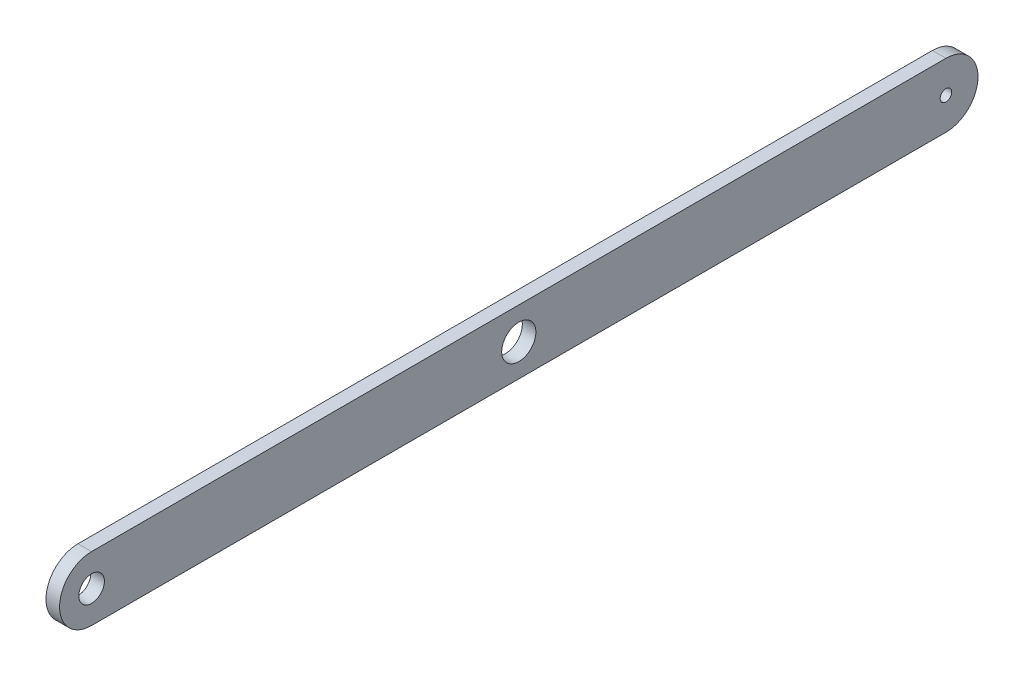
ISO-10303-21;
HEADER;
FILE_DESCRIPTION(('STEP AP214'),'2;1');
FILE_NAME('part.step','',(''),(''),'','','');
FILE_SCHEMA(('AUTOMOTIVE_DESIGN { 1 0 10303 214 1 1 1 1 }'));
ENDSEC;
DATA;
#1=APPLICATION_CONTEXT('core data for automotive mechanical design processes');
#2=APPLICATION_PROTOCOL_DEFINITION('international standard','automotive_design',2000,#1);
#3=PRODUCT_CONTEXT('',#1,'mechanical');
#4=PRODUCT('Part','Part','',(#3));
#5=PRODUCT_RELATED_PRODUCT_CATEGORY('part','',(#4));
#6=PRODUCT_DEFINITION_FORMATION('','',#4);
#7=PRODUCT_DEFINITION_CONTEXT('part definition',#1,'design');
#8=PRODUCT_DEFINITION('design','',#6,#7);
#9=PRODUCT_DEFINITION_SHAPE('','',#8);
#10=(LENGTH_UNIT() NAMED_UNIT(*) SI_UNIT(.MILLI.,.METRE.));
#11=(NAMED_UNIT(*) PLANE_ANGLE_UNIT() SI_UNIT($,.RADIAN.));
#12=(NAMED_UNIT(*) SI_UNIT($,.STERADIAN.) SOLID_ANGLE_UNIT());
#13=UNCERTAINTY_MEASURE_WITH_UNIT(LENGTH_MEASURE(1.E-05),#10,'distance_accuracy_value','');
#14=(GEOMETRIC_REPRESENTATION_CONTEXT(3) GLOBAL_UNCERTAINTY_ASSIGNED_CONTEXT((#13)) GLOBAL_UNIT_ASSIGNED_CONTEXT((#10,
#11,#12)) REPRESENTATION_CONTEXT('',''));
#15=CARTESIAN_POINT('',(0.,0.,0.));
#16=DIRECTION('',(0.,0.,1.));
#17=DIRECTION('',(1.,0.,0.));
#18=AXIS2_PLACEMENT_3D('',#15,#16,#17);
#19=CARTESIAN_POINT('',(3.175,-7.49999999999998,0.));
#20=DIRECTION('',(0.,1.,0.));
#21=DIRECTION('',(0.,0.,1.));
#22=AXIS2_PLACEMENT_3D('',#19,#20,#21);
#23=PLANE('',#22);
#24=DIRECTION('',(0.,0.,-1.));
#25=VECTOR('',#24,1.);
#26=CARTESIAN_POINT('',(0.,-7.49999999999998,0.));
#27=LINE('',#26,#25);
#28=CARTESIAN_POINT('',(0.,-7.5,100.));
#29=VERTEX_POINT('',#28);
#30=CARTESIAN_POINT('',(0.,-7.49999999999996,-100.));
#31=VERTEX_POINT('',#30);
#32=EDGE_CURVE('E126',#29,#31,#27,.T.);
#33=ORIENTED_EDGE('',*,*,#32,.T.);
#34=DIRECTION('',(-1.,0.,0.));
#35=VECTOR('',#34,1.);
#36=CARTESIAN_POINT('',(3.175,-7.49999999999996,-100.));
#37=LINE('',#36,#35);
#38=CARTESIAN_POINT('',(3.175,-7.49999999999996,-100.));
#39=VERTEX_POINT('',#38);
#40=EDGE_CURVE('E11',#39,#31,#37,.T.);
#41=ORIENTED_EDGE('',*,*,#40,.F.);
#42=DIRECTION('',(0.,0.,-1.));
#43=VECTOR('',#42,1.);
#44=CARTESIAN_POINT('',(3.175,-7.49999999999998,0.));
#45=LINE('',#44,#43);
#46=CARTESIAN_POINT('',(3.175,-7.5,100.));
#47=VERTEX_POINT('',#46);
#48=EDGE_CURVE('E98',#47,#39,#45,.T.);
#49=ORIENTED_EDGE('',*,*,#48,.F.);
#50=DIRECTION('',(-1.,0.,0.));
#51=VECTOR('',#50,1.);
#52=CARTESIAN_POINT('',(3.175,-7.5,100.));
#53=LINE('',#52,#51);
#54=EDGE_CURVE('E113',#47,#29,#53,.T.);
#55=ORIENTED_EDGE('',*,*,#54,.T.);
#56=EDGE_LOOP('',(#33,#41,#49,#55));
#57=FACE_BOUND('',#56,.T.);
#58=ADVANCED_FACE('F46',(#57),#23,.F.);
#59=CARTESIAN_POINT('',(3.175,0.,-100.));
#60=DIRECTION('',(-1.,0.,0.));
#61=DIRECTION('',(0.,0.,1.));
#62=AXIS2_PLACEMENT_3D('',#59,#60,#61);
#63=CYLINDRICAL_SURFACE('',#62,7.5);
#64=CARTESIAN_POINT('',(0.,0.,-100.));
#65=DIRECTION('',(1.,0.,0.));
#66=DIRECTION('',(0.,0.,-1.));
#67=AXIS2_PLACEMENT_3D('',#64,#65,#66);
#68=CIRCLE('',#67,7.5);
#69=CARTESIAN_POINT('',(0.,7.50000000000004,-100.));
#70=VERTEX_POINT('',#69);
#71=EDGE_CURVE('E103',#31,#70,#68,.T.);
#72=ORIENTED_EDGE('',*,*,#71,.T.);
#73=DIRECTION('',(-1.,0.,0.));
#74=VECTOR('',#73,1.);
#75=CARTESIAN_POINT('',(3.175,7.50000000000004,-100.));
#76=LINE('',#75,#74);
#77=CARTESIAN_POINT('',(3.175,7.50000000000004,-100.));
#78=VERTEX_POINT('',#77);
#79=EDGE_CURVE('E55',#78,#70,#76,.T.);
#80=ORIENTED_EDGE('',*,*,#79,.F.);
#81=CARTESIAN_POINT('',(3.175,0.,-100.));
#82=DIRECTION('',(1.,0.,0.));
#83=DIRECTION('',(0.,0.,-1.));
#84=AXIS2_PLACEMENT_3D('',#81,#82,#83);
#85=CIRCLE('',#84,7.5);
#86=EDGE_CURVE('E93',#39,#78,#85,.T.);
#87=ORIENTED_EDGE('',*,*,#86,.F.);
#88=ORIENTED_EDGE('',*,*,#40,.T.);
#89=EDGE_LOOP('',(#72,#80,#87,#88));
#90=FACE_BOUND('',#89,.T.);
#91=ADVANCED_FACE('F102',(#90),#63,.T.);
#92=CARTESIAN_POINT('',(3.175,7.50000000000002,0.));
#93=DIRECTION('',(0.,1.,0.));
#94=DIRECTION('',(0.,0.,1.));
#95=AXIS2_PLACEMENT_3D('',#92,#93,#94);
#96=PLANE('',#95);
#97=DIRECTION('',(0.,0.,-1.));
#98=VECTOR('',#97,1.);
#99=CARTESIAN_POINT('',(0.,7.50000000000002,0.));
#100=LINE('',#99,#98);
#101=CARTESIAN_POINT('',(0.,7.5,100.));
#102=VERTEX_POINT('',#101);
#103=EDGE_CURVE('E130',#102,#70,#100,.T.);
#104=ORIENTED_EDGE('',*,*,#103,.F.);
#105=DIRECTION('',(-1.,0.,0.));
#106=VECTOR('',#105,1.);
#107=CARTESIAN_POINT('',(3.175,7.5,100.));
#108=LINE('',#107,#106);
#109=CARTESIAN_POINT('',(3.175,7.5,100.));
#110=VERTEX_POINT('',#109);
#111=EDGE_CURVE('E83',#110,#102,#108,.T.);
#112=ORIENTED_EDGE('',*,*,#111,.F.);
#113=DIRECTION('',(0.,0.,-1.));
#114=VECTOR('',#113,1.);
#115=CARTESIAN_POINT('',(3.175,7.50000000000002,0.));
#116=LINE('',#115,#114);
#117=EDGE_CURVE('E96',#110,#78,#116,.T.);
#118=ORIENTED_EDGE('',*,*,#117,.T.);
#119=ORIENTED_EDGE('',*,*,#79,.T.);
#120=EDGE_LOOP('',(#104,#112,#118,#119));
#121=FACE_BOUND('',#120,.T.);
#122=ADVANCED_FACE('F107',(#121),#96,.T.);
#123=CARTESIAN_POINT('',(3.175,0.,100.));
#124=DIRECTION('',(-1.,0.,0.));
#125=DIRECTION('',(0.,0.,1.));
#126=AXIS2_PLACEMENT_3D('',#123,#124,#125);
#127=CYLINDRICAL_SURFACE('',#126,3.00000000000001);
#128=CARTESIAN_POINT('',(3.175,0.,100.));
#129=DIRECTION('',(1.,0.,0.));
#130=DIRECTION('',(0.,0.,-1.));
#131=AXIS2_PLACEMENT_3D('',#128,#129,#130);
#132=CIRCLE('',#131,3.00000000000001);
#133=CARTESIAN_POINT('',(3.175,0.,97.));
#134=VERTEX_POINT('',#133);
#135=EDGE_CURVE('E139',#134,#134,#132,.T.);
#136=ORIENTED_EDGE('',*,*,#135,.T.);
#137=EDGE_LOOP('',(#136));
#138=FACE_BOUND('',#137,.T.);
#139=CARTESIAN_POINT('',(0.,0.,100.));
#140=DIRECTION('',(1.,0.,0.));
#141=DIRECTION('',(0.,0.,-1.));
#142=AXIS2_PLACEMENT_3D('',#139,#140,#141);
#143=CIRCLE('',#142,3.00000000000001);
#144=CARTESIAN_POINT('',(0.,0.,97.));
#145=VERTEX_POINT('',#144);
#146=EDGE_CURVE('E121',#145,#145,#143,.T.);
#147=ORIENTED_EDGE('',*,*,#146,.F.);
#148=EDGE_LOOP('',(#147));
#149=FACE_BOUND('',#148,.T.);
#150=ADVANCED_FACE('F164',(#138,#149),#127,.F.);
#151=CARTESIAN_POINT('',(3.175,0.,0.));
#152=DIRECTION('',(-1.,0.,0.));
#153=DIRECTION('',(0.,0.,1.));
#154=AXIS2_PLACEMENT_3D('',#151,#152,#153);
#155=CYLINDRICAL_SURFACE('',#154,4.);
#156=CARTESIAN_POINT('',(3.175,0.,0.));
#157=DIRECTION('',(1.,0.,0.));
#158=DIRECTION('',(0.,0.,-1.));
#159=AXIS2_PLACEMENT_3D('',#156,#157,#158);
#160=CIRCLE('',#159,4.);
#161=CARTESIAN_POINT('',(3.175,0.,-4.));
#162=VERTEX_POINT('',#161);
#163=EDGE_CURVE('E134',#162,#162,#160,.T.);
#164=ORIENTED_EDGE('',*,*,#163,.T.);
#165=EDGE_LOOP('',(#164));
#166=FACE_BOUND('',#165,.T.);
#167=CARTESIAN_POINT('',(0.,0.,0.));
#168=DIRECTION('',(1.,0.,0.));
#169=DIRECTION('',(0.,0.,-1.));
#170=AXIS2_PLACEMENT_3D('',#167,#168,#169);
#171=CIRCLE('',#170,4.);
#172=CARTESIAN_POINT('',(0.,0.,-4.));
#173=VERTEX_POINT('',#172);
#174=EDGE_CURVE('E117',#173,#173,#171,.T.);
#175=ORIENTED_EDGE('',*,*,#174,.F.);
#176=EDGE_LOOP('',(#175));
#177=FACE_BOUND('',#176,.T.);
#178=ADVANCED_FACE('F48',(#166,#177),#155,.F.);
#179=CARTESIAN_POINT('',(3.175,0.,100.));
#180=DIRECTION('',(-1.,0.,0.));
#181=DIRECTION('',(0.,0.,1.));
#182=AXIS2_PLACEMENT_3D('',#179,#180,#181);
#183=CYLINDRICAL_SURFACE('',#182,7.5);
#184=CARTESIAN_POINT('',(0.,0.,100.));
#185=DIRECTION('',(1.,0.,0.));
#186=DIRECTION('',(0.,0.,-1.));
#187=AXIS2_PLACEMENT_3D('',#184,#185,#186);
#188=CIRCLE('',#187,7.5);
#189=EDGE_CURVE('E86',#102,#29,#188,.T.);
#190=ORIENTED_EDGE('',*,*,#189,.T.);
#191=ORIENTED_EDGE('',*,*,#54,.F.);
#192=CARTESIAN_POINT('',(3.175,0.,100.));
#193=DIRECTION('',(1.,0.,0.));
#194=DIRECTION('',(0.,0.,-1.));
#195=AXIS2_PLACEMENT_3D('',#192,#193,#194);
#196=CIRCLE('',#195,7.5);
#197=EDGE_CURVE('E66',#110,#47,#196,.T.);
#198=ORIENTED_EDGE('',*,*,#197,.F.);
#199=ORIENTED_EDGE('',*,*,#111,.T.);
#200=EDGE_LOOP('',(#190,#191,#198,#199));
#201=FACE_BOUND('',#200,.T.);
#202=ADVANCED_FACE('F158',(#201),#183,.T.);
#203=CARTESIAN_POINT('',(3.175,0.,0.));
#204=DIRECTION('',(1.,0.,0.));
#205=DIRECTION('',(0.,0.,-1.));
#206=AXIS2_PLACEMENT_3D('',#203,#204,#205);
#207=PLANE('',#206);
#208=CARTESIAN_POINT('',(3.175,0.,-100.));
#209=DIRECTION('',(1.,0.,0.));
#210=DIRECTION('',(0.,0.,-1.));
#211=AXIS2_PLACEMENT_3D('',#208,#209,#210);
#212=CIRCLE('',#211,1.35255);
#213=CARTESIAN_POINT('',(3.175,0.,-101.35255));
#214=VERTEX_POINT('',#213);
#215=EDGE_CURVE('E149',#214,#214,#212,.T.);
#216=ORIENTED_EDGE('',*,*,#215,.F.);
#217=EDGE_LOOP('',(#216));
#218=FACE_BOUND('',#217,.T.);
#219=ORIENTED_EDGE('',*,*,#163,.F.);
#220=EDGE_LOOP('',(#219));
#221=FACE_BOUND('',#220,.T.);
#222=ORIENTED_EDGE('',*,*,#135,.F.);
#223=EDGE_LOOP('',(#222));
#224=FACE_BOUND('',#223,.T.);
#225=ORIENTED_EDGE('',*,*,#48,.T.);
#226=ORIENTED_EDGE('',*,*,#86,.T.);
#227=ORIENTED_EDGE('',*,*,#117,.F.);
#228=ORIENTED_EDGE('',*,*,#197,.T.);
#229=EDGE_LOOP('',(#225,#226,#227,#228));
#230=FACE_BOUND('',#229,.T.);
#231=ADVANCED_FACE('F94',(#218,#221,#224,#230),#207,.T.);
#232=CARTESIAN_POINT('',(0.,0.,0.));
#233=DIRECTION('',(1.,0.,0.));
#234=DIRECTION('',(0.,0.,-1.));
#235=AXIS2_PLACEMENT_3D('',#232,#233,#234);
#236=PLANE('',#235);
#237=CARTESIAN_POINT('',(0.,0.,-100.));
#238=DIRECTION('',(1.,0.,0.));
#239=DIRECTION('',(0.,0.,-1.));
#240=AXIS2_PLACEMENT_3D('',#237,#238,#239);
#241=CIRCLE('',#240,1.35255);
#242=CARTESIAN_POINT('',(0.,0.,-101.35255));
#243=VERTEX_POINT('',#242);
#244=EDGE_CURVE('E122',#243,#243,#241,.T.);
#245=ORIENTED_EDGE('',*,*,#244,.T.);
#246=EDGE_LOOP('',(#245));
#247=FACE_BOUND('',#246,.T.);
#248=ORIENTED_EDGE('',*,*,#174,.T.);
#249=EDGE_LOOP('',(#248));
#250=FACE_BOUND('',#249,.T.);
#251=ORIENTED_EDGE('',*,*,#146,.T.);
#252=EDGE_LOOP('',(#251));
#253=FACE_BOUND('',#252,.T.);
#254=ORIENTED_EDGE('',*,*,#32,.F.);
#255=ORIENTED_EDGE('',*,*,#189,.F.);
#256=ORIENTED_EDGE('',*,*,#103,.T.);
#257=ORIENTED_EDGE('',*,*,#71,.F.);
#258=EDGE_LOOP('',(#254,#255,#256,#257));
#259=FACE_BOUND('',#258,.T.);
#260=ADVANCED_FACE('F157',(#247,#250,#253,#259),#236,.F.);
#261=CARTESIAN_POINT('',(3.175,0.,-100.));
#262=DIRECTION('',(1.,0.,0.));
#263=DIRECTION('',(0.,0.,-1.));
#264=AXIS2_PLACEMENT_3D('',#261,#262,#263);
#265=CYLINDRICAL_SURFACE('',#264,1.35255);
#266=ORIENTED_EDGE('',*,*,#244,.F.);
#267=EDGE_LOOP('',(#266));
#268=FACE_BOUND('',#267,.T.);
#269=ORIENTED_EDGE('',*,*,#215,.T.);
#270=EDGE_LOOP('',(#269));
#271=FACE_BOUND('',#270,.T.);
#272=ADVANCED_FACE('F153',(#268,#271),#265,.F.);
#273=CLOSED_SHELL('',(#58,#91,#122,#150,#178,#202,#231,#260,#272));
#274=MANIFOLD_SOLID_BREP('B2',#273);
#275=ADVANCED_BREP_SHAPE_REPRESENTATION('',(#18,#274),#14);
#276=SHAPE_DEFINITION_REPRESENTATION(#9,#275);
ENDSEC;
END-ISO-10303-21;
